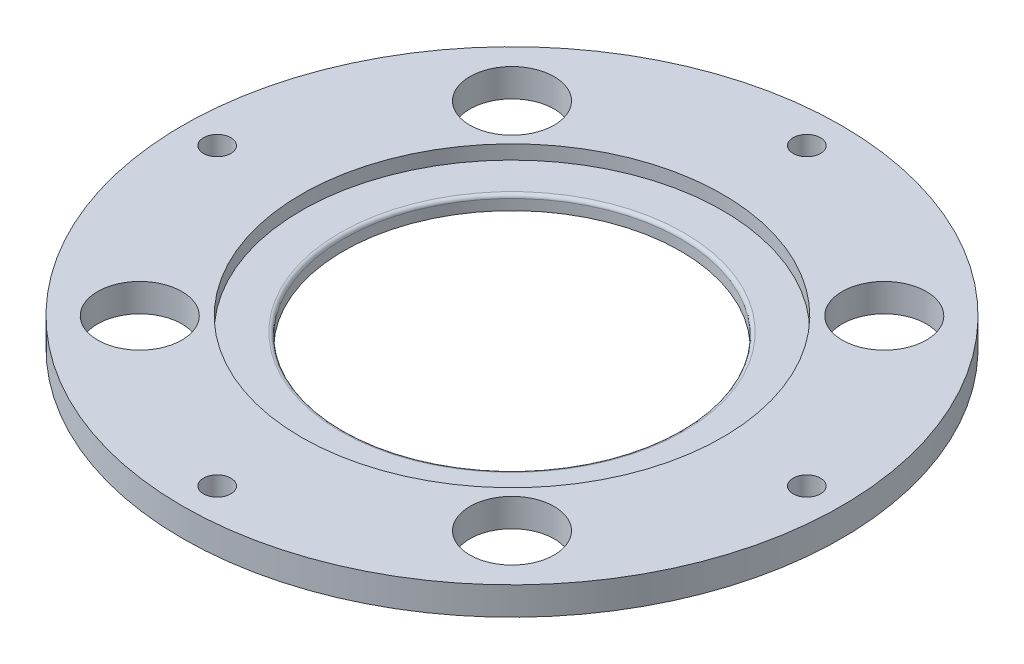
ISO-10303-21;
HEADER;
FILE_DESCRIPTION(('STEP AP214'),'2;1');
FILE_NAME('part.step','',(''),(''),'','','');
FILE_SCHEMA(('AUTOMOTIVE_DESIGN { 1 0 10303 214 1 1 1 1 }'));
ENDSEC;
DATA;
#1=APPLICATION_CONTEXT('core data for automotive mechanical design processes');
#2=APPLICATION_PROTOCOL_DEFINITION('international standard','automotive_design',2000,#1);
#3=PRODUCT_CONTEXT('',#1,'mechanical');
#4=PRODUCT('Part','Part','',(#3));
#5=PRODUCT_RELATED_PRODUCT_CATEGORY('part','',(#4));
#6=PRODUCT_DEFINITION_FORMATION('','',#4);
#7=PRODUCT_DEFINITION_CONTEXT('part definition',#1,'design');
#8=PRODUCT_DEFINITION('design','',#6,#7);
#9=PRODUCT_DEFINITION_SHAPE('','',#8);
#10=(LENGTH_UNIT() NAMED_UNIT(*) SI_UNIT(.MILLI.,.METRE.));
#11=(NAMED_UNIT(*) PLANE_ANGLE_UNIT() SI_UNIT($,.RADIAN.));
#12=(NAMED_UNIT(*) SI_UNIT($,.STERADIAN.) SOLID_ANGLE_UNIT());
#13=UNCERTAINTY_MEASURE_WITH_UNIT(LENGTH_MEASURE(1.E-05),#10,'distance_accuracy_value','');
#14=(GEOMETRIC_REPRESENTATION_CONTEXT(3) GLOBAL_UNCERTAINTY_ASSIGNED_CONTEXT((#13)) GLOBAL_UNIT_ASSIGNED_CONTEXT((#10,
#11,#12)) REPRESENTATION_CONTEXT('',''));
#15=CARTESIAN_POINT('',(0.,0.,0.));
#16=DIRECTION('',(0.,0.,1.));
#17=DIRECTION('',(1.,0.,0.));
#18=AXIS2_PLACEMENT_3D('',#15,#16,#17);
#19=CARTESIAN_POINT('',(0.,2.,0.));
#20=DIRECTION('',(0.,1.,0.));
#21=DIRECTION('',(0.,0.,1.));
#22=AXIS2_PLACEMENT_3D('',#19,#20,#21);
#23=PLANE('',#22);
#24=CARTESIAN_POINT('',(-26.5165042944955,2.,-26.5165042944956));
#25=DIRECTION('',(0.,1.,0.));
#26=DIRECTION('',(0.,0.,1.));
#27=AXIS2_PLACEMENT_3D('',#24,#25,#26);
#28=CIRCLE('',#27,6.);
#29=CARTESIAN_POINT('',(-26.5165042944955,2.,-20.5165042944956));
#30=VERTEX_POINT('',#29);
#31=EDGE_CURVE('E61',#30,#30,#28,.T.);
#32=ORIENTED_EDGE('',*,*,#31,.F.);
#33=EDGE_LOOP('',(#32));
#34=FACE_BOUND('',#33,.T.);
#35=CARTESIAN_POINT('',(26.5165042944956,2.,-26.5165042944955));
#36=DIRECTION('',(0.,1.,0.));
#37=DIRECTION('',(0.,0.,1.));
#38=AXIS2_PLACEMENT_3D('',#35,#36,#37);
#39=CIRCLE('',#38,6.00000000000011);
#40=CARTESIAN_POINT('',(26.5165042944956,2.,-20.5165042944954));
#41=VERTEX_POINT('',#40);
#42=EDGE_CURVE('E103',#41,#41,#39,.T.);
#43=ORIENTED_EDGE('',*,*,#42,.F.);
#44=EDGE_LOOP('',(#43));
#45=FACE_BOUND('',#44,.T.);
#46=CARTESIAN_POINT('',(26.5165042944955,2.,26.5165042944956));
#47=DIRECTION('',(0.,1.,0.));
#48=DIRECTION('',(0.,0.,1.));
#49=AXIS2_PLACEMENT_3D('',#46,#47,#48);
#50=CIRCLE('',#49,6.00000000000024);
#51=CARTESIAN_POINT('',(26.5165042944955,2.,32.5165042944958));
#52=VERTEX_POINT('',#51);
#53=EDGE_CURVE('E100',#52,#52,#50,.T.);
#54=ORIENTED_EDGE('',*,*,#53,.F.);
#55=EDGE_LOOP('',(#54));
#56=FACE_BOUND('',#55,.T.);
#57=CARTESIAN_POINT('',(-26.5165042944956,2.,26.5165042944955));
#58=DIRECTION('',(0.,1.,0.));
#59=DIRECTION('',(0.,0.,1.));
#60=AXIS2_PLACEMENT_3D('',#57,#58,#59);
#61=CIRCLE('',#60,6.00000000000034);
#62=CARTESIAN_POINT('',(-26.5165042944956,2.,32.5165042944958));
#63=VERTEX_POINT('',#62);
#64=EDGE_CURVE('E97',#63,#63,#61,.T.);
#65=ORIENTED_EDGE('',*,*,#64,.F.);
#66=EDGE_LOOP('',(#65));
#67=FACE_BOUND('',#66,.T.);
#68=CARTESIAN_POINT('',(-2.93284432462823E-13,2.,42.));
#69=DIRECTION('',(0.,1.,0.));
#70=DIRECTION('',(0.,0.,1.));
#71=AXIS2_PLACEMENT_3D('',#68,#69,#70);
#72=CIRCLE('',#71,1.95);
#73=CARTESIAN_POINT('',(-2.93284432462823E-13,2.,43.95));
#74=VERTEX_POINT('',#73);
#75=EDGE_CURVE('E81',#74,#74,#72,.T.);
#76=ORIENTED_EDGE('',*,*,#75,.F.);
#77=EDGE_LOOP('',(#76));
#78=FACE_BOUND('',#77,.T.);
#79=CARTESIAN_POINT('',(0.,2.,0.));
#80=DIRECTION('',(0.,1.,0.));
#81=DIRECTION('',(0.,0.,1.));
#82=AXIS2_PLACEMENT_3D('',#79,#80,#81);
#83=CIRCLE('',#82,30.);
#84=CARTESIAN_POINT('',(0.,2.,30.));
#85=VERTEX_POINT('',#84);
#86=EDGE_CURVE('E72',#85,#85,#83,.T.);
#87=ORIENTED_EDGE('',*,*,#86,.F.);
#88=EDGE_LOOP('',(#87));
#89=FACE_BOUND('',#88,.T.);
#90=CARTESIAN_POINT('',(0.,2.,0.));
#91=DIRECTION('',(0.,1.,0.));
#92=DIRECTION('',(0.,0.,1.));
#93=AXIS2_PLACEMENT_3D('',#90,#91,#92);
#94=CIRCLE('',#93,46.95);
#95=CARTESIAN_POINT('',(0.,2.,46.95));
#96=VERTEX_POINT('',#95);
#97=EDGE_CURVE('E46',#96,#96,#94,.T.);
#98=ORIENTED_EDGE('',*,*,#97,.T.);
#99=EDGE_LOOP('',(#98));
#100=FACE_BOUND('',#99,.T.);
#101=CARTESIAN_POINT('',(0.,2.,-42.));
#102=DIRECTION('',(0.,1.,0.));
#103=DIRECTION('',(0.,0.,1.));
#104=AXIS2_PLACEMENT_3D('',#101,#102,#103);
#105=CIRCLE('',#104,1.95);
#106=CARTESIAN_POINT('',(0.,2.,-40.05));
#107=VERTEX_POINT('',#106);
#108=EDGE_CURVE('E66',#107,#107,#105,.T.);
#109=ORIENTED_EDGE('',*,*,#108,.F.);
#110=EDGE_LOOP('',(#109));
#111=FACE_BOUND('',#110,.T.);
#112=CARTESIAN_POINT('',(42.,2.,1.46642216231412E-13));
#113=DIRECTION('',(0.,1.,0.));
#114=DIRECTION('',(0.,0.,1.));
#115=AXIS2_PLACEMENT_3D('',#112,#113,#114);
#116=CIRCLE('',#115,1.95);
#117=CARTESIAN_POINT('',(42.,2.,1.95000000000015));
#118=VERTEX_POINT('',#117);
#119=EDGE_CURVE('E77',#118,#118,#116,.T.);
#120=ORIENTED_EDGE('',*,*,#119,.F.);
#121=EDGE_LOOP('',(#120));
#122=FACE_BOUND('',#121,.T.);
#123=CARTESIAN_POINT('',(-42.,2.,-4.39926648694235E-13));
#124=DIRECTION('',(0.,1.,0.));
#125=DIRECTION('',(0.,0.,1.));
#126=AXIS2_PLACEMENT_3D('',#123,#124,#125);
#127=CIRCLE('',#126,1.95);
#128=CARTESIAN_POINT('',(-42.,2.,1.94999999999956));
#129=VERTEX_POINT('',#128);
#130=EDGE_CURVE('E87',#129,#129,#127,.T.);
#131=ORIENTED_EDGE('',*,*,#130,.F.);
#132=EDGE_LOOP('',(#131));
#133=FACE_BOUND('',#132,.T.);
#134=ADVANCED_FACE('F31',(#34,#45,#56,#67,#78,#89,#100,#111,#122,#133),#23,.T.);
#135=CARTESIAN_POINT('',(0.,-2.,0.));
#136=DIRECTION('',(0.,1.,0.));
#137=DIRECTION('',(0.,0.,1.));
#138=AXIS2_PLACEMENT_3D('',#135,#136,#137);
#139=PLANE('',#138);
#140=CARTESIAN_POINT('',(-26.5165042944955,-2.,-26.5165042944956));
#141=DIRECTION('',(0.,1.,0.));
#142=DIRECTION('',(0.,0.,1.));
#143=AXIS2_PLACEMENT_3D('',#140,#141,#142);
#144=CIRCLE('',#143,6.);
#145=CARTESIAN_POINT('',(-26.5165042944955,-2.,-20.5165042944956));
#146=VERTEX_POINT('',#145);
#147=EDGE_CURVE('E49',#146,#146,#144,.T.);
#148=ORIENTED_EDGE('',*,*,#147,.T.);
#149=EDGE_LOOP('',(#148));
#150=FACE_BOUND('',#149,.T.);
#151=CARTESIAN_POINT('',(26.5165042944956,-2.,-26.5165042944955));
#152=DIRECTION('',(0.,1.,0.));
#153=DIRECTION('',(0.,0.,1.));
#154=AXIS2_PLACEMENT_3D('',#151,#152,#153);
#155=CIRCLE('',#154,6.00000000000011);
#156=CARTESIAN_POINT('',(26.5165042944956,-2.,-20.5165042944954));
#157=VERTEX_POINT('',#156);
#158=EDGE_CURVE('E53',#157,#157,#155,.T.);
#159=ORIENTED_EDGE('',*,*,#158,.T.);
#160=EDGE_LOOP('',(#159));
#161=FACE_BOUND('',#160,.T.);
#162=CARTESIAN_POINT('',(26.5165042944955,-2.,26.5165042944956));
#163=DIRECTION('',(0.,1.,0.));
#164=DIRECTION('',(0.,0.,1.));
#165=AXIS2_PLACEMENT_3D('',#162,#163,#164);
#166=CIRCLE('',#165,6.00000000000024);
#167=CARTESIAN_POINT('',(26.5165042944955,-2.,32.5165042944958));
#168=VERTEX_POINT('',#167);
#169=EDGE_CURVE('E56',#168,#168,#166,.T.);
#170=ORIENTED_EDGE('',*,*,#169,.T.);
#171=EDGE_LOOP('',(#170));
#172=FACE_BOUND('',#171,.T.);
#173=CARTESIAN_POINT('',(-26.5165042944956,-2.,26.5165042944955));
#174=DIRECTION('',(0.,1.,0.));
#175=DIRECTION('',(0.,0.,1.));
#176=AXIS2_PLACEMENT_3D('',#173,#174,#175);
#177=CIRCLE('',#176,6.00000000000034);
#178=CARTESIAN_POINT('',(-26.5165042944956,-2.,32.5165042944958));
#179=VERTEX_POINT('',#178);
#180=EDGE_CURVE('E59',#179,#179,#177,.T.);
#181=ORIENTED_EDGE('',*,*,#180,.T.);
#182=EDGE_LOOP('',(#181));
#183=FACE_BOUND('',#182,.T.);
#184=CARTESIAN_POINT('',(0.,-2.,0.));
#185=DIRECTION('',(0.,1.,0.));
#186=DIRECTION('',(0.,0.,1.));
#187=AXIS2_PLACEMENT_3D('',#184,#185,#186);
#188=CIRCLE('',#187,46.95);
#189=CARTESIAN_POINT('',(0.,-2.,46.95));
#190=VERTEX_POINT('',#189);
#191=EDGE_CURVE('E63',#190,#190,#188,.T.);
#192=ORIENTED_EDGE('',*,*,#191,.F.);
#193=EDGE_LOOP('',(#192));
#194=FACE_BOUND('',#193,.T.);
#195=CARTESIAN_POINT('',(0.,-2.,-42.));
#196=DIRECTION('',(0.,1.,0.));
#197=DIRECTION('',(0.,0.,1.));
#198=AXIS2_PLACEMENT_3D('',#195,#196,#197);
#199=CIRCLE('',#198,1.95);
#200=CARTESIAN_POINT('',(0.,-2.,-40.05));
#201=VERTEX_POINT('',#200);
#202=EDGE_CURVE('E69',#201,#201,#199,.T.);
#203=ORIENTED_EDGE('',*,*,#202,.T.);
#204=EDGE_LOOP('',(#203));
#205=FACE_BOUND('',#204,.T.);
#206=CARTESIAN_POINT('',(42.,-2.,1.46642216231412E-13));
#207=DIRECTION('',(0.,1.,0.));
#208=DIRECTION('',(0.,0.,1.));
#209=AXIS2_PLACEMENT_3D('',#206,#207,#208);
#210=CIRCLE('',#209,1.95);
#211=CARTESIAN_POINT('',(42.,-2.,1.95000000000015));
#212=VERTEX_POINT('',#211);
#213=EDGE_CURVE('E78',#212,#212,#210,.T.);
#214=ORIENTED_EDGE('',*,*,#213,.T.);
#215=EDGE_LOOP('',(#214));
#216=FACE_BOUND('',#215,.T.);
#217=CARTESIAN_POINT('',(-2.93284432462823E-13,-2.,42.));
#218=DIRECTION('',(0.,1.,0.));
#219=DIRECTION('',(0.,0.,1.));
#220=AXIS2_PLACEMENT_3D('',#217,#218,#219);
#221=CIRCLE('',#220,1.95);
#222=CARTESIAN_POINT('',(-2.93284432462823E-13,-2.,43.95));
#223=VERTEX_POINT('',#222);
#224=EDGE_CURVE('E84',#223,#223,#221,.T.);
#225=ORIENTED_EDGE('',*,*,#224,.T.);
#226=EDGE_LOOP('',(#225));
#227=FACE_BOUND('',#226,.T.);
#228=CARTESIAN_POINT('',(-42.,-2.,-4.39926648694235E-13));
#229=DIRECTION('',(0.,1.,0.));
#230=DIRECTION('',(0.,0.,1.));
#231=AXIS2_PLACEMENT_3D('',#228,#229,#230);
#232=CIRCLE('',#231,1.95);
#233=CARTESIAN_POINT('',(-42.,-2.,1.94999999999956));
#234=VERTEX_POINT('',#233);
#235=EDGE_CURVE('E90',#234,#234,#232,.T.);
#236=ORIENTED_EDGE('',*,*,#235,.T.);
#237=EDGE_LOOP('',(#236));
#238=FACE_BOUND('',#237,.T.);
#239=CARTESIAN_POINT('',(0.,-2.,0.));
#240=DIRECTION('',(0.,-1.,0.));
#241=DIRECTION('',(0.,0.,-1.));
#242=AXIS2_PLACEMENT_3D('',#239,#240,#241);
#243=CIRCLE('',#242,24.);
#244=CARTESIAN_POINT('',(0.,-1.99999999999999,-24.));
#245=VERTEX_POINT('',#244);
#246=EDGE_CURVE('E52',#245,#245,#243,.T.);
#247=ORIENTED_EDGE('',*,*,#246,.F.);
#248=EDGE_LOOP('',(#247));
#249=FACE_BOUND('',#248,.T.);
#250=ADVANCED_FACE('F114',(#150,#161,#172,#183,#194,#205,#216,#227,#238,#249),#139,.F.);
#251=CARTESIAN_POINT('',(0.,2.,0.));
#252=DIRECTION('',(0.,-1.,0.));
#253=DIRECTION('',(0.,0.,-1.));
#254=AXIS2_PLACEMENT_3D('',#251,#252,#253);
#255=CYLINDRICAL_SURFACE('',#254,46.95);
#256=ORIENTED_EDGE('',*,*,#97,.F.);
#257=EDGE_LOOP('',(#256));
#258=FACE_BOUND('',#257,.T.);
#259=ORIENTED_EDGE('',*,*,#191,.T.);
#260=EDGE_LOOP('',(#259));
#261=FACE_BOUND('',#260,.T.);
#262=ADVANCED_FACE('F144',(#258,#261),#255,.T.);
#263=CARTESIAN_POINT('',(0.,2.,-42.));
#264=DIRECTION('',(0.,-1.,0.));
#265=DIRECTION('',(0.,0.,-1.));
#266=AXIS2_PLACEMENT_3D('',#263,#264,#265);
#267=CYLINDRICAL_SURFACE('',#266,1.95);
#268=ORIENTED_EDGE('',*,*,#108,.T.);
#269=EDGE_LOOP('',(#268));
#270=FACE_BOUND('',#269,.T.);
#271=ORIENTED_EDGE('',*,*,#202,.F.);
#272=EDGE_LOOP('',(#271));
#273=FACE_BOUND('',#272,.T.);
#274=ADVANCED_FACE('F171',(#270,#273),#267,.F.);
#275=CARTESIAN_POINT('',(0.,2.,0.));
#276=DIRECTION('',(0.,-1.,0.));
#277=DIRECTION('',(0.,0.,-1.));
#278=AXIS2_PLACEMENT_3D('',#275,#276,#277);
#279=CYLINDRICAL_SURFACE('',#278,30.);
#280=CARTESIAN_POINT('',(0.,0.,0.));
#281=DIRECTION('',(0.,1.,0.));
#282=DIRECTION('',(0.,0.,1.));
#283=AXIS2_PLACEMENT_3D('',#280,#281,#282);
#284=CIRCLE('',#283,30.);
#285=CARTESIAN_POINT('',(0.,0.,30.));
#286=VERTEX_POINT('',#285);
#287=EDGE_CURVE('E42',#286,#286,#284,.T.);
#288=ORIENTED_EDGE('',*,*,#287,.F.);
#289=EDGE_LOOP('',(#288));
#290=FACE_BOUND('',#289,.T.);
#291=ORIENTED_EDGE('',*,*,#86,.T.);
#292=EDGE_LOOP('',(#291));
#293=FACE_BOUND('',#292,.T.);
#294=ADVANCED_FACE('F167',(#290,#293),#279,.F.);
#295=CARTESIAN_POINT('',(42.,2.,1.46642216231412E-13));
#296=DIRECTION('',(0.,-1.,0.));
#297=DIRECTION('',(0.,0.,-1.));
#298=AXIS2_PLACEMENT_3D('',#295,#296,#297);
#299=CYLINDRICAL_SURFACE('',#298,1.95);
#300=ORIENTED_EDGE('',*,*,#119,.T.);
#301=EDGE_LOOP('',(#300));
#302=FACE_BOUND('',#301,.T.);
#303=ORIENTED_EDGE('',*,*,#213,.F.);
#304=EDGE_LOOP('',(#303));
#305=FACE_BOUND('',#304,.T.);
#306=ADVANCED_FACE('F163',(#302,#305),#299,.F.);
#307=CARTESIAN_POINT('',(-2.93284432462823E-13,2.,42.));
#308=DIRECTION('',(0.,-1.,0.));
#309=DIRECTION('',(0.,0.,-1.));
#310=AXIS2_PLACEMENT_3D('',#307,#308,#309);
#311=CYLINDRICAL_SURFACE('',#310,1.95);
#312=ORIENTED_EDGE('',*,*,#75,.T.);
#313=EDGE_LOOP('',(#312));
#314=FACE_BOUND('',#313,.T.);
#315=ORIENTED_EDGE('',*,*,#224,.F.);
#316=EDGE_LOOP('',(#315));
#317=FACE_BOUND('',#316,.T.);
#318=ADVANCED_FACE('F138',(#314,#317),#311,.F.);
#319=CARTESIAN_POINT('',(-42.,2.,-4.39926648694235E-13));
#320=DIRECTION('',(0.,-1.,0.));
#321=DIRECTION('',(0.,0.,-1.));
#322=AXIS2_PLACEMENT_3D('',#319,#320,#321);
#323=CYLINDRICAL_SURFACE('',#322,1.95);
#324=ORIENTED_EDGE('',*,*,#130,.T.);
#325=EDGE_LOOP('',(#324));
#326=FACE_BOUND('',#325,.T.);
#327=ORIENTED_EDGE('',*,*,#235,.F.);
#328=EDGE_LOOP('',(#327));
#329=FACE_BOUND('',#328,.T.);
#330=ADVANCED_FACE('F134',(#326,#329),#323,.F.);
#331=CARTESIAN_POINT('',(0.,84.8528137423857,0.));
#332=DIRECTION('',(0.,-1.,0.));
#333=DIRECTION('',(0.,0.,-1.));
#334=AXIS2_PLACEMENT_3D('',#331,#332,#333);
#335=CYLINDRICAL_SURFACE('',#334,24.);
#336=CARTESIAN_POINT('',(0.,-0.5,0.));
#337=DIRECTION('',(0.,1.,0.));
#338=DIRECTION('',(0.,0.,1.));
#339=AXIS2_PLACEMENT_3D('',#336,#337,#338);
#340=CIRCLE('',#339,24.);
#341=CARTESIAN_POINT('',(0.,-0.500000000000014,-24.));
#342=VERTEX_POINT('',#341);
#343=EDGE_CURVE('E10',#342,#342,#340,.T.);
#344=CARTESIAN_POINT('',(0.,-0.500000000000014,-24.));
#345=CARTESIAN_POINT('',(0.,-0.515625000000015,-24.));
#346=CARTESIAN_POINT('',(0.,-0.531250000000016,-24.));
#347=CARTESIAN_POINT('',(0.,-0.562500000000017,-24.));
#348=CARTESIAN_POINT('',(0.,-0.578125000000017,-24.));
#349=CARTESIAN_POINT('',(0.,-0.609375000000014,-24.));
#350=CARTESIAN_POINT('',(0.,-0.62500000000001,-24.));
#351=CARTESIAN_POINT('',(0.,-0.656250000000006,-24.));
#352=CARTESIAN_POINT('',(0.,-0.671875000000007,-24.));
#353=CARTESIAN_POINT('',(0.,-0.703125000000008,-24.));
#354=CARTESIAN_POINT('',(0.,-0.718750000000009,-24.));
#355=CARTESIAN_POINT('',(0.,-0.75000000000001,-24.));
#356=CARTESIAN_POINT('',(0.,-0.765625000000011,-24.));
#357=CARTESIAN_POINT('',(0.,-0.796875000000012,-24.));
#358=CARTESIAN_POINT('',(0.,-0.812500000000012,-24.));
#359=CARTESIAN_POINT('',(0.,-0.843750000000009,-24.));
#360=CARTESIAN_POINT('',(0.,-0.859375000000005,-24.));
#361=CARTESIAN_POINT('',(0.,-0.890625000000001,-24.));
#362=CARTESIAN_POINT('',(0.,-0.906250000000002,-24.));
#363=CARTESIAN_POINT('',(0.,-0.937500000000003,-24.));
#364=CARTESIAN_POINT('',(0.,-0.953125000000004,-24.));
#365=CARTESIAN_POINT('',(0.,-0.984375000000005,-24.));
#366=CARTESIAN_POINT('',(0.,-1.00000000000001,-24.));
#367=CARTESIAN_POINT('',(0.,-1.03125000000001,-24.));
#368=CARTESIAN_POINT('',(0.,-1.04687500000001,-24.));
#369=CARTESIAN_POINT('',(0.,-1.07812500000001,-24.));
#370=CARTESIAN_POINT('',(0.,-1.09375000000001,-24.));
#371=CARTESIAN_POINT('',(0.,-1.12500000000001,-24.));
#372=CARTESIAN_POINT('',(0.,-1.140625,-24.));
#373=CARTESIAN_POINT('',(0.,-1.171875,-24.));
#374=CARTESIAN_POINT('',(0.,-1.1875,-24.));
#375=CARTESIAN_POINT('',(0.,-1.21875,-24.));
#376=CARTESIAN_POINT('',(0.,-1.234375,-24.));
#377=CARTESIAN_POINT('',(0.,-1.265625,-24.));
#378=CARTESIAN_POINT('',(0.,-1.28125,-24.));
#379=CARTESIAN_POINT('',(0.,-1.3125,-24.));
#380=CARTESIAN_POINT('',(0.,-1.328125,-24.));
#381=CARTESIAN_POINT('',(0.,-1.359375,-24.));
#382=CARTESIAN_POINT('',(0.,-1.375,-24.));
#383=CARTESIAN_POINT('',(0.,-1.40624999999999,-24.));
#384=CARTESIAN_POINT('',(0.,-1.42187499999999,-24.));
#385=CARTESIAN_POINT('',(0.,-1.45312499999999,-24.));
#386=CARTESIAN_POINT('',(0.,-1.46875,-24.));
#387=CARTESIAN_POINT('',(0.,-1.5,-24.));
#388=CARTESIAN_POINT('',(0.,-1.515625,-24.));
#389=CARTESIAN_POINT('',(0.,-1.546875,-24.));
#390=CARTESIAN_POINT('',(0.,-1.5625,-24.));
#391=CARTESIAN_POINT('',(0.,-1.59375,-24.));
#392=CARTESIAN_POINT('',(0.,-1.609375,-24.));
#393=CARTESIAN_POINT('',(0.,-1.640625,-24.));
#394=CARTESIAN_POINT('',(0.,-1.65624999999999,-24.));
#395=CARTESIAN_POINT('',(0.,-1.68749999999999,-24.));
#396=CARTESIAN_POINT('',(0.,-1.70312499999999,-24.));
#397=CARTESIAN_POINT('',(0.,-1.73437499999999,-24.));
#398=CARTESIAN_POINT('',(0.,-1.74999999999999,-24.));
#399=CARTESIAN_POINT('',(0.,-1.78124999999999,-24.));
#400=CARTESIAN_POINT('',(0.,-1.79687499999999,-24.));
#401=CARTESIAN_POINT('',(0.,-1.828125,-24.));
#402=CARTESIAN_POINT('',(0.,-1.84375,-24.));
#403=CARTESIAN_POINT('',(0.,-1.87499999999999,-24.));
#404=CARTESIAN_POINT('',(0.,-1.89062499999999,-24.));
#405=CARTESIAN_POINT('',(0.,-1.92187499999998,-24.));
#406=CARTESIAN_POINT('',(0.,-1.93749999999999,-24.));
#407=CARTESIAN_POINT('',(0.,-1.96874999999999,-24.));
#408=CARTESIAN_POINT('',(0.,-1.98437499999999,-24.));
#409=CARTESIAN_POINT('',(0.,-1.99999999999999,-24.));
#410=B_SPLINE_CURVE_WITH_KNOTS('',3,(#344,#345,#346,#347,#348,#349,#350,#351,#352,#353,#354,
#355,#356,#357,#358,#359,#360,#361,#362,#363,#364,#365,#366,#367,#368,#369,#370,#371,#372,#373,
#374,#375,#376,#377,#378,#379,#380,#381,#382,#383,#384,#385,#386,#387,#388,#389,#390,#391,#392,
#393,#394,#395,#396,#397,#398,#399,#400,#401,#402,#403,#404,#405,#406,#407,#408,#409),
.UNSPECIFIED.,.F.,.F.,(4,2,2,2,2,2,2,2,2,2,2,2,2,2,2,2,2,2,2,2,2,2,2,2,2,2,2,2,2,2,2,2,4),(0.,
0.0468750000000018,0.0937500000000036,0.140624999999991,0.187499999999993,0.234374999999995,
0.281249999999997,0.328124999999999,0.374999999999986,0.421874999999988,0.46874999999999,
0.515624999999992,0.562499999999994,0.609374999999995,0.656249999999983,0.703124999999985,
0.749999999999987,0.796874999999989,0.84374999999999,0.890624999999978,0.93749999999998,
0.984374999999982,1.03124999999998,1.07812499999999,1.12499999999999,1.17187499999998,
1.21874999999998,1.26562499999998,1.31249999999998,1.35937499999998,1.40624999999997,
1.45312499999997,1.49999999999997),.UNSPECIFIED.);
#411=EDGE_CURVE('BSEAM137',#342,#245,#410,.T.);
#412=ORIENTED_EDGE('',*,*,#343,.T.);
#413=ORIENTED_EDGE('',*,*,#246,.T.);
#414=ORIENTED_EDGE('',*,*,#411,.T.);
#415=ORIENTED_EDGE('',*,*,#411,.F.);
#416=EDGE_LOOP('',(#412,#414,#413,#415));
#417=FACE_BOUND('',#416,.T.);
#418=ADVANCED_FACE('F137',(#417),#335,.F.);
#419=CARTESIAN_POINT('',(0.,0.,0.));
#420=DIRECTION('',(0.,1.,0.));
#421=DIRECTION('',(0.,0.,1.));
#422=AXIS2_PLACEMENT_3D('',#419,#420,#421);
#423=PLANE('',#422);
#424=CARTESIAN_POINT('',(0.,0.,0.));
#425=DIRECTION('',(0.,1.,0.));
#426=DIRECTION('',(0.,0.,1.));
#427=AXIS2_PLACEMENT_3D('',#424,#425,#426);
#428=CIRCLE('',#427,24.5);
#429=CARTESIAN_POINT('',(0.,0.,24.5));
#430=VERTEX_POINT('',#429);
#431=EDGE_CURVE('E38',#430,#430,#428,.F.);
#432=ORIENTED_EDGE('',*,*,#431,.T.);
#433=EDGE_LOOP('',(#432));
#434=FACE_BOUND('',#433,.T.);
#435=ORIENTED_EDGE('',*,*,#287,.T.);
#436=EDGE_LOOP('',(#435));
#437=FACE_BOUND('',#436,.T.);
#438=ADVANCED_FACE('F150',(#434,#437),#423,.T.);
#439=CARTESIAN_POINT('',(-26.5165042944956,-31.,26.5165042944955));
#440=DIRECTION('',(0.,1.,0.));
#441=DIRECTION('',(0.,0.,1.));
#442=AXIS2_PLACEMENT_3D('',#439,#440,#441);
#443=CYLINDRICAL_SURFACE('',#442,6.00000000000034);
#444=ORIENTED_EDGE('',*,*,#64,.T.);
#445=EDGE_LOOP('',(#444));
#446=FACE_BOUND('',#445,.T.);
#447=ORIENTED_EDGE('',*,*,#180,.F.);
#448=EDGE_LOOP('',(#447));
#449=FACE_BOUND('',#448,.T.);
#450=ADVANCED_FACE('F156',(#446,#449),#443,.F.);
#451=CARTESIAN_POINT('',(26.5165042944955,-31.,26.5165042944956));
#452=DIRECTION('',(0.,1.,0.));
#453=DIRECTION('',(0.,0.,1.));
#454=AXIS2_PLACEMENT_3D('',#451,#452,#453);
#455=CYLINDRICAL_SURFACE('',#454,6.00000000000024);
#456=ORIENTED_EDGE('',*,*,#53,.T.);
#457=EDGE_LOOP('',(#456));
#458=FACE_BOUND('',#457,.T.);
#459=ORIENTED_EDGE('',*,*,#169,.F.);
#460=EDGE_LOOP('',(#459));
#461=FACE_BOUND('',#460,.T.);
#462=ADVANCED_FACE('F233',(#458,#461),#455,.F.);
#463=CARTESIAN_POINT('',(26.5165042944956,-31.,-26.5165042944955));
#464=DIRECTION('',(0.,1.,0.));
#465=DIRECTION('',(0.,0.,1.));
#466=AXIS2_PLACEMENT_3D('',#463,#464,#465);
#467=CYLINDRICAL_SURFACE('',#466,6.00000000000011);
#468=ORIENTED_EDGE('',*,*,#42,.T.);
#469=EDGE_LOOP('',(#468));
#470=FACE_BOUND('',#469,.T.);
#471=ORIENTED_EDGE('',*,*,#158,.F.);
#472=EDGE_LOOP('',(#471));
#473=FACE_BOUND('',#472,.T.);
#474=ADVANCED_FACE('F239',(#470,#473),#467,.F.);
#475=CARTESIAN_POINT('',(-26.5165042944955,-31.,-26.5165042944956));
#476=DIRECTION('',(0.,1.,0.));
#477=DIRECTION('',(0.,0.,1.));
#478=AXIS2_PLACEMENT_3D('',#475,#476,#477);
#479=CYLINDRICAL_SURFACE('',#478,6.);
#480=ORIENTED_EDGE('',*,*,#31,.T.);
#481=EDGE_LOOP('',(#480));
#482=FACE_BOUND('',#481,.T.);
#483=ORIENTED_EDGE('',*,*,#147,.F.);
#484=EDGE_LOOP('',(#483));
#485=FACE_BOUND('',#484,.T.);
#486=ADVANCED_FACE('F109',(#482,#485),#479,.F.);
#487=CARTESIAN_POINT('',(0.,-0.5,0.));
#488=DIRECTION('',(0.,1.,0.));
#489=DIRECTION('',(0.,0.,1.));
#490=AXIS2_PLACEMENT_3D('',#487,#488,#489);
#491=TOROIDAL_SURFACE('',#490,24.5,0.5);
#492=ORIENTED_EDGE('',*,*,#343,.F.);
#493=EDGE_LOOP('',(#492));
#494=FACE_BOUND('',#493,.T.);
#495=ORIENTED_EDGE('',*,*,#431,.F.);
#496=EDGE_LOOP('',(#495));
#497=FACE_BOUND('',#496,.T.);
#498=ADVANCED_FACE('F33',(#494,#497),#491,.T.);
#499=CLOSED_SHELL('',(#134,#250,#262,#274,#294,#306,#318,#330,#418,#438,#450,#462,#474,#486,#498));
#500=MANIFOLD_SOLID_BREP('B2',#499);
#501=ADVANCED_BREP_SHAPE_REPRESENTATION('',(#18,#500),#14);
#502=SHAPE_DEFINITION_REPRESENTATION(#9,#501);
ENDSEC;
END-ISO-10303-21;
